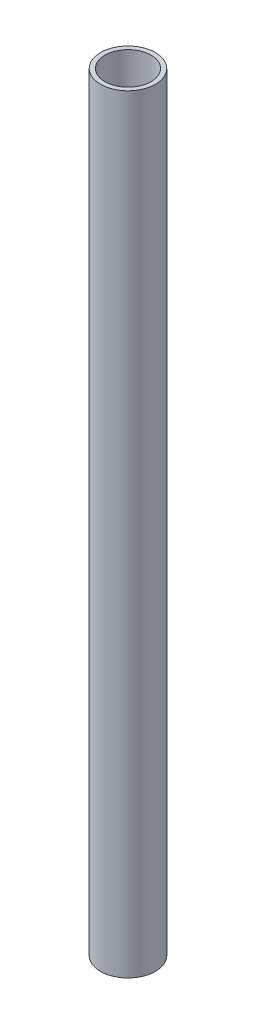
ISO-10303-21;
HEADER;
FILE_DESCRIPTION(('STEP AP214'),'2;1');
FILE_NAME('part.step','',(''),(''),'','','');
FILE_SCHEMA(('AUTOMOTIVE_DESIGN { 1 0 10303 214 1 1 1 1 }'));
ENDSEC;
DATA;
#1=APPLICATION_CONTEXT('core data for automotive mechanical design processes');
#2=APPLICATION_PROTOCOL_DEFINITION('international standard','automotive_design',2000,#1);
#3=PRODUCT_CONTEXT('',#1,'mechanical');
#4=PRODUCT('Part','Part','',(#3));
#5=PRODUCT_RELATED_PRODUCT_CATEGORY('part','',(#4));
#6=PRODUCT_DEFINITION_FORMATION('','',#4);
#7=PRODUCT_DEFINITION_CONTEXT('part definition',#1,'design');
#8=PRODUCT_DEFINITION('design','',#6,#7);
#9=PRODUCT_DEFINITION_SHAPE('','',#8);
#10=(LENGTH_UNIT() NAMED_UNIT(*) SI_UNIT(.MILLI.,.METRE.));
#11=(NAMED_UNIT(*) PLANE_ANGLE_UNIT() SI_UNIT($,.RADIAN.));
#12=(NAMED_UNIT(*) SI_UNIT($,.STERADIAN.) SOLID_ANGLE_UNIT());
#13=UNCERTAINTY_MEASURE_WITH_UNIT(LENGTH_MEASURE(1.E-05),#10,'distance_accuracy_value','');
#14=(GEOMETRIC_REPRESENTATION_CONTEXT(3) GLOBAL_UNCERTAINTY_ASSIGNED_CONTEXT((#13)) GLOBAL_UNIT_ASSIGNED_CONTEXT((#10,
#11,#12)) REPRESENTATION_CONTEXT('',''));
#15=CARTESIAN_POINT('',(0.,0.,0.));
#16=DIRECTION('',(0.,0.,1.));
#17=DIRECTION('',(1.,0.,0.));
#18=AXIS2_PLACEMENT_3D('',#15,#16,#17);
#19=CARTESIAN_POINT('',(0.,350.,0.));
#20=DIRECTION('',(0.,1.,0.));
#21=DIRECTION('',(0.,0.,1.));
#22=AXIS2_PLACEMENT_3D('',#19,#20,#21);
#23=PLANE('',#22);
#24=CARTESIAN_POINT('',(0.,350.,0.));
#25=DIRECTION('',(0.,1.,0.));
#26=DIRECTION('',(0.,0.,1.));
#27=AXIS2_PLACEMENT_3D('',#24,#25,#26);
#28=CIRCLE('',#27,12.5);
#29=CARTESIAN_POINT('',(0.,350.,12.5));
#30=VERTEX_POINT('',#29);
#31=EDGE_CURVE('E10',#30,#30,#28,.T.);
#32=ORIENTED_EDGE('',*,*,#31,.T.);
#33=EDGE_LOOP('',(#32));
#34=FACE_BOUND('',#33,.T.);
#35=CARTESIAN_POINT('',(0.,350.,0.));
#36=DIRECTION('',(0.,1.,0.));
#37=DIRECTION('',(0.,0.,1.));
#38=AXIS2_PLACEMENT_3D('',#35,#36,#37);
#39=CIRCLE('',#38,10.5);
#40=CARTESIAN_POINT('',(0.,350.,10.5));
#41=VERTEX_POINT('',#40);
#42=EDGE_CURVE('E59',#41,#41,#39,.T.);
#43=ORIENTED_EDGE('',*,*,#42,.F.);
#44=EDGE_LOOP('',(#43));
#45=FACE_BOUND('',#44,.T.);
#46=ADVANCED_FACE('F47',(#34,#45),#23,.T.);
#47=CARTESIAN_POINT('',(0.,0.,0.));
#48=DIRECTION('',(0.,1.,0.));
#49=DIRECTION('',(0.,0.,1.));
#50=AXIS2_PLACEMENT_3D('',#47,#48,#49);
#51=PLANE('',#50);
#52=CARTESIAN_POINT('',(0.,0.,0.));
#53=DIRECTION('',(0.,1.,0.));
#54=DIRECTION('',(0.,0.,1.));
#55=AXIS2_PLACEMENT_3D('',#52,#53,#54);
#56=CIRCLE('',#55,12.5);
#57=CARTESIAN_POINT('',(0.,0.,12.5));
#58=VERTEX_POINT('',#57);
#59=EDGE_CURVE('E51',#58,#58,#56,.T.);
#60=ORIENTED_EDGE('',*,*,#59,.F.);
#61=EDGE_LOOP('',(#60));
#62=FACE_BOUND('',#61,.T.);
#63=CARTESIAN_POINT('',(0.,0.,0.));
#64=DIRECTION('',(0.,1.,0.));
#65=DIRECTION('',(0.,0.,1.));
#66=AXIS2_PLACEMENT_3D('',#63,#64,#65);
#67=CIRCLE('',#66,10.5);
#68=CARTESIAN_POINT('',(0.,0.,10.5));
#69=VERTEX_POINT('',#68);
#70=EDGE_CURVE('E61',#69,#69,#67,.T.);
#71=ORIENTED_EDGE('',*,*,#70,.T.);
#72=EDGE_LOOP('',(#71));
#73=FACE_BOUND('',#72,.T.);
#74=ADVANCED_FACE('F71',(#62,#73),#51,.F.);
#75=CARTESIAN_POINT('',(0.,350.,0.));
#76=DIRECTION('',(0.,-1.,0.));
#77=DIRECTION('',(0.,0.,-1.));
#78=AXIS2_PLACEMENT_3D('',#75,#76,#77);
#79=CYLINDRICAL_SURFACE('',#78,12.5);
#80=ORIENTED_EDGE('',*,*,#31,.F.);
#81=EDGE_LOOP('',(#80));
#82=FACE_BOUND('',#81,.T.);
#83=ORIENTED_EDGE('',*,*,#59,.T.);
#84=EDGE_LOOP('',(#83));
#85=FACE_BOUND('',#84,.T.);
#86=ADVANCED_FACE('F49',(#82,#85),#79,.T.);
#87=CARTESIAN_POINT('',(0.,350.,0.));
#88=DIRECTION('',(0.,-1.,0.));
#89=DIRECTION('',(0.,0.,-1.));
#90=AXIS2_PLACEMENT_3D('',#87,#88,#89);
#91=CYLINDRICAL_SURFACE('',#90,10.5);
#92=ORIENTED_EDGE('',*,*,#42,.T.);
#93=EDGE_LOOP('',(#92));
#94=FACE_BOUND('',#93,.T.);
#95=ORIENTED_EDGE('',*,*,#70,.F.);
#96=EDGE_LOOP('',(#95));
#97=FACE_BOUND('',#96,.T.);
#98=ADVANCED_FACE('F67',(#94,#97),#91,.F.);
#99=CLOSED_SHELL('',(#46,#74,#86,#98));
#100=MANIFOLD_SOLID_BREP('B2',#99);
#101=ADVANCED_BREP_SHAPE_REPRESENTATION('',(#18,#100),#14);
#102=SHAPE_DEFINITION_REPRESENTATION(#9,#101);
ENDSEC;
END-ISO-10303-21;
